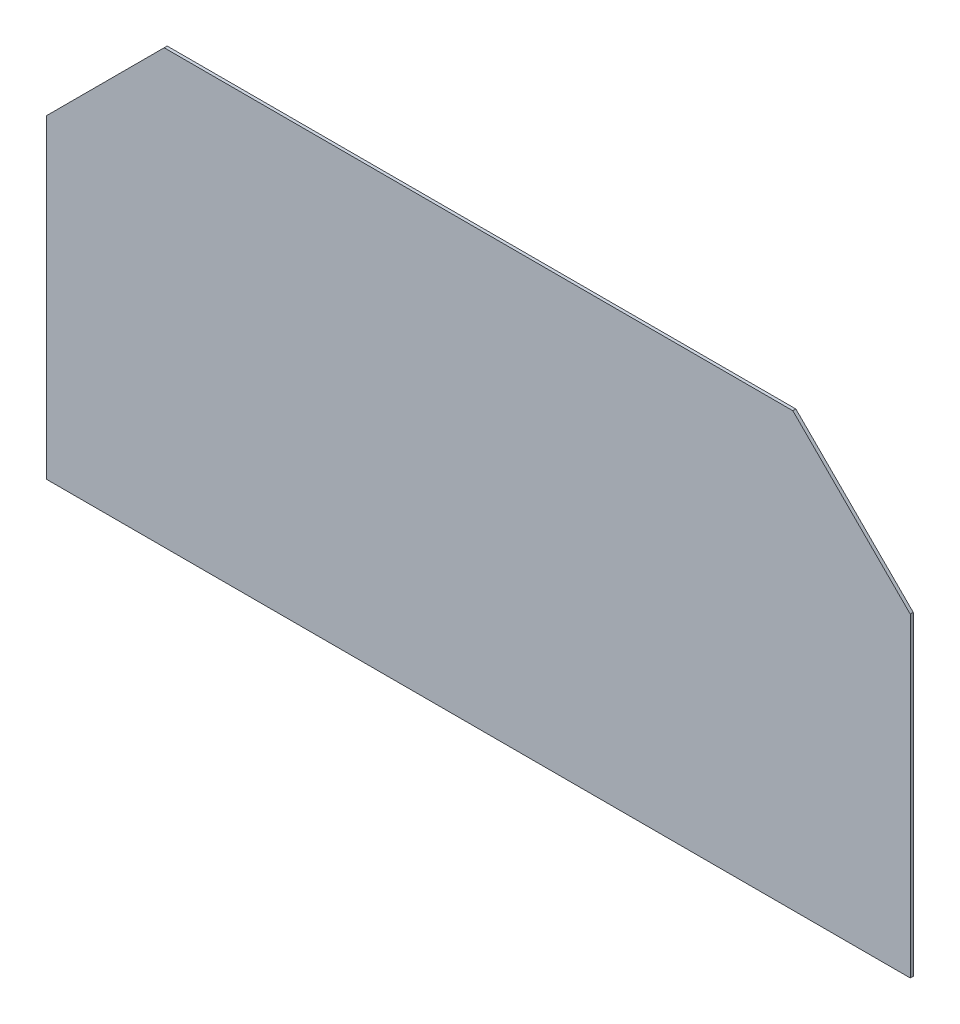
ISO-10303-21;
HEADER;
FILE_DESCRIPTION(('STEP AP214'),'2;1');
FILE_NAME('part.step','',(''),(''),'','','');
FILE_SCHEMA(('AUTOMOTIVE_DESIGN { 1 0 10303 214 1 1 1 1 }'));
ENDSEC;
DATA;
#1=APPLICATION_CONTEXT('core data for automotive mechanical design processes');
#2=APPLICATION_PROTOCOL_DEFINITION('international standard','automotive_design',2000,#1);
#3=PRODUCT_CONTEXT('',#1,'mechanical');
#4=PRODUCT('Part','Part','',(#3));
#5=PRODUCT_RELATED_PRODUCT_CATEGORY('part','',(#4));
#6=PRODUCT_DEFINITION_FORMATION('','',#4);
#7=PRODUCT_DEFINITION_CONTEXT('part definition',#1,'design');
#8=PRODUCT_DEFINITION('design','',#6,#7);
#9=PRODUCT_DEFINITION_SHAPE('','',#8);
#10=(LENGTH_UNIT() NAMED_UNIT(*) SI_UNIT(.MILLI.,.METRE.));
#11=(NAMED_UNIT(*) PLANE_ANGLE_UNIT() SI_UNIT($,.RADIAN.));
#12=(NAMED_UNIT(*) SI_UNIT($,.STERADIAN.) SOLID_ANGLE_UNIT());
#13=UNCERTAINTY_MEASURE_WITH_UNIT(LENGTH_MEASURE(1.E-05),#10,'distance_accuracy_value','');
#14=(GEOMETRIC_REPRESENTATION_CONTEXT(3) GLOBAL_UNCERTAINTY_ASSIGNED_CONTEXT((#13)) GLOBAL_UNIT_ASSIGNED_CONTEXT((#10,
#11,#12)) REPRESENTATION_CONTEXT('',''));
#15=CARTESIAN_POINT('',(0.,0.,0.));
#16=DIRECTION('',(0.,0.,1.));
#17=DIRECTION('',(1.,0.,0.));
#18=AXIS2_PLACEMENT_3D('',#15,#16,#17);
#19=CARTESIAN_POINT('',(-26.4640181879776,26.4176639802868,0.28));
#20=DIRECTION('',(1.,0.,0.));
#21=DIRECTION('',(0.,0.,-1.));
#22=AXIS2_PLACEMENT_3D('',#19,#20,#21);
#23=PLANE('',#22);
#24=DIRECTION('',(0.,-1.,0.));
#25=VECTOR('',#24,1.);
#26=CARTESIAN_POINT('',(-26.4640181879776,26.4176639802868,0.28));
#27=LINE('',#26,#25);
#28=CARTESIAN_POINT('',(-26.4640181879776,15.5176639802868,0.28));
#29=VERTEX_POINT('',#28);
#30=CARTESIAN_POINT('',(-26.4640181879776,-13.7323360197132,0.28));
#31=VERTEX_POINT('',#30);
#32=EDGE_CURVE('E102',#29,#31,#27,.T.);
#33=ORIENTED_EDGE('',*,*,#32,.F.);
#34=DIRECTION('',(0.,0.,1.));
#35=VECTOR('',#34,1.);
#36=CARTESIAN_POINT('',(-26.4640181879776,15.5176639802868,-9.72));
#37=LINE('',#36,#35);
#38=CARTESIAN_POINT('',(-26.4640181879776,15.5176639802868,0.));
#39=VERTEX_POINT('',#38);
#40=EDGE_CURVE('E90',#39,#29,#37,.T.);
#41=ORIENTED_EDGE('',*,*,#40,.F.);
#42=DIRECTION('',(0.,-1.,0.));
#43=VECTOR('',#42,1.);
#44=CARTESIAN_POINT('',(-26.4640181879776,26.4176639802868,0.));
#45=LINE('',#44,#43);
#46=CARTESIAN_POINT('',(-26.4640181879776,-13.7323360197132,0.));
#47=VERTEX_POINT('',#46);
#48=EDGE_CURVE('E124',#39,#47,#45,.T.);
#49=ORIENTED_EDGE('',*,*,#48,.T.);
#50=DIRECTION('',(0.,0.,-1.));
#51=VECTOR('',#50,1.);
#52=CARTESIAN_POINT('',(-26.4640181879776,-13.7323360197132,0.28));
#53=LINE('',#52,#51);
#54=EDGE_CURVE('E109',#31,#47,#53,.T.);
#55=ORIENTED_EDGE('',*,*,#54,.F.);
#56=EDGE_LOOP('',(#33,#41,#49,#55));
#57=FACE_BOUND('',#56,.T.);
#58=ADVANCED_FACE('F40',(#57),#23,.F.);
#59=CARTESIAN_POINT('',(-26.4640181879776,-13.7323360197132,0.28));
#60=DIRECTION('',(0.,1.,0.));
#61=DIRECTION('',(-1.,0.,0.));
#62=AXIS2_PLACEMENT_3D('',#59,#60,#61);
#63=PLANE('',#62);
#64=DIRECTION('',(1.,0.,0.));
#65=VECTOR('',#64,1.);
#66=CARTESIAN_POINT('',(-26.4640181879776,-13.7323360197132,0.));
#67=LINE('',#66,#65);
#68=CARTESIAN_POINT('',(53.6859818120224,-13.7323360197132,0.));
#69=VERTEX_POINT('',#68);
#70=EDGE_CURVE('E126',#47,#69,#67,.T.);
#71=ORIENTED_EDGE('',*,*,#70,.T.);
#72=DIRECTION('',(0.,0.,-1.));
#73=VECTOR('',#72,1.);
#74=CARTESIAN_POINT('',(53.6859818120224,-13.7323360197132,0.28));
#75=LINE('',#74,#73);
#76=CARTESIAN_POINT('',(53.6859818120224,-13.7323360197132,0.28));
#77=VERTEX_POINT('',#76);
#78=EDGE_CURVE('E123',#77,#69,#75,.T.);
#79=ORIENTED_EDGE('',*,*,#78,.F.);
#80=DIRECTION('',(1.,0.,0.));
#81=VECTOR('',#80,1.);
#82=CARTESIAN_POINT('',(-26.4640181879776,-13.7323360197132,0.28));
#83=LINE('',#82,#81);
#84=EDGE_CURVE('E110',#31,#77,#83,.T.);
#85=ORIENTED_EDGE('',*,*,#84,.F.);
#86=ORIENTED_EDGE('',*,*,#54,.T.);
#87=EDGE_LOOP('',(#71,#79,#85,#86));
#88=FACE_BOUND('',#87,.T.);
#89=ADVANCED_FACE('F144',(#88),#63,.F.);
#90=CARTESIAN_POINT('',(53.6859818120224,26.4176639802868,0.28));
#91=DIRECTION('',(1.,0.,0.));
#92=DIRECTION('',(0.,0.,-1.));
#93=AXIS2_PLACEMENT_3D('',#90,#91,#92);
#94=PLANE('',#93);
#95=DIRECTION('',(0.,0.,1.));
#96=VECTOR('',#95,1.);
#97=CARTESIAN_POINT('',(53.6859818120224,15.5176639802868,-110.));
#98=LINE('',#97,#96);
#99=CARTESIAN_POINT('',(53.6859818120224,15.5176639802867,0.));
#100=VERTEX_POINT('',#99);
#101=CARTESIAN_POINT('',(53.6859818120224,15.5176639802868,0.28));
#102=VERTEX_POINT('',#101);
#103=EDGE_CURVE('E61',#100,#102,#98,.T.);
#104=ORIENTED_EDGE('',*,*,#103,.T.);
#105=DIRECTION('',(0.,-1.,0.));
#106=VECTOR('',#105,1.);
#107=CARTESIAN_POINT('',(53.6859818120224,26.4176639802868,0.28));
#108=LINE('',#107,#106);
#109=EDGE_CURVE('E113',#102,#77,#108,.T.);
#110=ORIENTED_EDGE('',*,*,#109,.T.);
#111=ORIENTED_EDGE('',*,*,#78,.T.);
#112=DIRECTION('',(0.,-1.,0.));
#113=VECTOR('',#112,1.);
#114=CARTESIAN_POINT('',(53.6859818120224,26.4176639802868,0.));
#115=LINE('',#114,#113);
#116=EDGE_CURVE('E115',#100,#69,#115,.T.);
#117=ORIENTED_EDGE('',*,*,#116,.F.);
#118=EDGE_LOOP('',(#104,#110,#111,#117));
#119=FACE_BOUND('',#118,.T.);
#120=ADVANCED_FACE('F140',(#119),#94,.T.);
#121=CARTESIAN_POINT('',(-26.4640181879776,26.4176639802868,0.28));
#122=DIRECTION('',(0.,1.,0.));
#123=DIRECTION('',(0.,0.,1.));
#124=AXIS2_PLACEMENT_3D('',#121,#122,#123);
#125=PLANE('',#124);
#126=DIRECTION('',(0.,0.,1.));
#127=VECTOR('',#126,1.);
#128=CARTESIAN_POINT('',(-15.5640181879776,26.4176639802868,-9.72));
#129=LINE('',#128,#127);
#130=CARTESIAN_POINT('',(-15.5640181879776,26.4176639802868,0.));
#131=VERTEX_POINT('',#130);
#132=CARTESIAN_POINT('',(-15.5640181879776,26.4176639802868,0.28));
#133=VERTEX_POINT('',#132);
#134=EDGE_CURVE('E54',#131,#133,#129,.T.);
#135=ORIENTED_EDGE('',*,*,#134,.T.);
#136=DIRECTION('',(1.,0.,0.));
#137=VECTOR('',#136,1.);
#138=CARTESIAN_POINT('',(-26.4640181879776,26.4176639802868,0.28));
#139=LINE('',#138,#137);
#140=CARTESIAN_POINT('',(42.7859818120224,26.4176639802868,0.28));
#141=VERTEX_POINT('',#140);
#142=EDGE_CURVE('E105',#133,#141,#139,.T.);
#143=ORIENTED_EDGE('',*,*,#142,.T.);
#144=DIRECTION('',(0.,0.,1.));
#145=VECTOR('',#144,1.);
#146=CARTESIAN_POINT('',(42.7859818120224,26.4176639802868,-110.));
#147=LINE('',#146,#145);
#148=CARTESIAN_POINT('',(42.7859818120224,26.4176639802868,0.));
#149=VERTEX_POINT('',#148);
#150=EDGE_CURVE('E118',#149,#141,#147,.T.);
#151=ORIENTED_EDGE('',*,*,#150,.F.);
#152=DIRECTION('',(1.,0.,0.));
#153=VECTOR('',#152,1.);
#154=CARTESIAN_POINT('',(-26.4640181879776,26.4176639802868,0.));
#155=LINE('',#154,#153);
#156=EDGE_CURVE('E111',#131,#149,#155,.T.);
#157=ORIENTED_EDGE('',*,*,#156,.F.);
#158=EDGE_LOOP('',(#135,#143,#151,#157));
#159=FACE_BOUND('',#158,.T.);
#160=ADVANCED_FACE('F146',(#159),#125,.T.);
#161=CARTESIAN_POINT('',(0.,0.,0.28));
#162=DIRECTION('',(0.,0.,1.));
#163=DIRECTION('',(1.,0.,0.));
#164=AXIS2_PLACEMENT_3D('',#161,#162,#163);
#165=PLANE('',#164);
#166=DIRECTION('',(0.707106781186547,0.707106781186547,0.));
#167=VECTOR('',#166,1.);
#168=CARTESIAN_POINT('',(-26.4640181879776,15.5176639802868,0.28));
#169=LINE('',#168,#167);
#170=EDGE_CURVE('E93',#29,#133,#169,.T.);
#171=ORIENTED_EDGE('',*,*,#170,.F.);
#172=ORIENTED_EDGE('',*,*,#32,.T.);
#173=ORIENTED_EDGE('',*,*,#84,.T.);
#174=ORIENTED_EDGE('',*,*,#109,.F.);
#175=DIRECTION('',(0.707106781186547,-0.707106781186547,0.));
#176=VECTOR('',#175,1.);
#177=CARTESIAN_POINT('',(53.6859818120224,15.5176639802868,0.28));
#178=LINE('',#177,#176);
#179=EDGE_CURVE('E147',#141,#102,#178,.T.);
#180=ORIENTED_EDGE('',*,*,#179,.F.);
#181=ORIENTED_EDGE('',*,*,#142,.F.);
#182=EDGE_LOOP('',(#171,#172,#173,#174,#180,#181));
#183=FACE_BOUND('',#182,.T.);
#184=ADVANCED_FACE('F100',(#183),#165,.T.);
#185=CARTESIAN_POINT('',(0.,0.,0.));
#186=DIRECTION('',(0.,0.,1.));
#187=DIRECTION('',(1.,0.,0.));
#188=AXIS2_PLACEMENT_3D('',#185,#186,#187);
#189=PLANE('',#188);
#190=ORIENTED_EDGE('',*,*,#48,.F.);
#191=DIRECTION('',(0.707106781186548,0.707106781186548,0.));
#192=VECTOR('',#191,1.);
#193=CARTESIAN_POINT('',(-20.9908410841322,20.9908410841322,0.));
#194=LINE('',#193,#192);
#195=EDGE_CURVE('E11',#39,#131,#194,.T.);
#196=ORIENTED_EDGE('',*,*,#195,.T.);
#197=ORIENTED_EDGE('',*,*,#156,.T.);
#198=DIRECTION('',(0.707106781186548,-0.707106781186548,0.));
#199=VECTOR('',#198,1.);
#200=CARTESIAN_POINT('',(34.6018228961546,34.6018228961546,0.));
#201=LINE('',#200,#199);
#202=EDGE_CURVE('E47',#149,#100,#201,.T.);
#203=ORIENTED_EDGE('',*,*,#202,.T.);
#204=ORIENTED_EDGE('',*,*,#116,.T.);
#205=ORIENTED_EDGE('',*,*,#70,.F.);
#206=EDGE_LOOP('',(#190,#196,#197,#203,#204,#205));
#207=FACE_BOUND('',#206,.T.);
#208=ADVANCED_FACE('F134',(#207),#189,.F.);
#209=CARTESIAN_POINT('',(53.6859818120224,15.5176639802868,-110.));
#210=DIRECTION('',(-0.707106781186548,-0.707106781186548,0.));
#211=DIRECTION('',(0.707106781186548,-0.707106781186548,0.));
#212=AXIS2_PLACEMENT_3D('',#209,#210,#211);
#213=PLANE('',#212);
#214=ORIENTED_EDGE('',*,*,#150,.T.);
#215=ORIENTED_EDGE('',*,*,#179,.T.);
#216=ORIENTED_EDGE('',*,*,#103,.F.);
#217=ORIENTED_EDGE('',*,*,#202,.F.);
#218=EDGE_LOOP('',(#214,#215,#216,#217));
#219=FACE_BOUND('',#218,.T.);
#220=ADVANCED_FACE('F150',(#219),#213,.F.);
#221=CARTESIAN_POINT('',(-26.4640181879776,15.5176639802868,-9.72));
#222=DIRECTION('',(0.707106781186548,-0.707106781186548,0.));
#223=DIRECTION('',(0.707106781186548,0.707106781186548,0.));
#224=AXIS2_PLACEMENT_3D('',#221,#222,#223);
#225=PLANE('',#224);
#226=ORIENTED_EDGE('',*,*,#40,.T.);
#227=ORIENTED_EDGE('',*,*,#170,.T.);
#228=ORIENTED_EDGE('',*,*,#134,.F.);
#229=ORIENTED_EDGE('',*,*,#195,.F.);
#230=EDGE_LOOP('',(#226,#227,#228,#229));
#231=FACE_BOUND('',#230,.T.);
#232=ADVANCED_FACE('F92',(#231),#225,.F.);
#233=CLOSED_SHELL('',(#58,#89,#120,#160,#184,#208,#220,#232));
#234=MANIFOLD_SOLID_BREP('B2',#233);
#235=ADVANCED_BREP_SHAPE_REPRESENTATION('',(#18,#234),#14);
#236=SHAPE_DEFINITION_REPRESENTATION(#9,#235);
ENDSEC;
END-ISO-10303-21;
